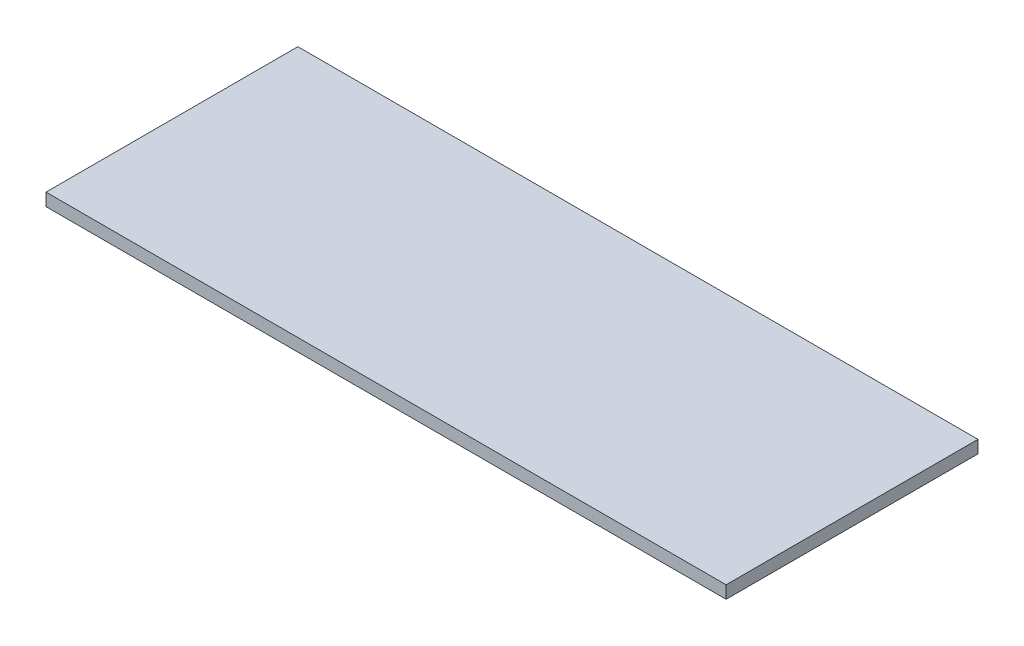
ISO-10303-21;
HEADER;
FILE_DESCRIPTION(('STEP AP214'),'2;1');
FILE_NAME('part.step','',(''),(''),'','','');
FILE_SCHEMA(('AUTOMOTIVE_DESIGN { 1 0 10303 214 1 1 1 1 }'));
ENDSEC;
DATA;
#1=APPLICATION_CONTEXT('core data for automotive mechanical design processes');
#2=APPLICATION_PROTOCOL_DEFINITION('international standard','automotive_design',2000,#1);
#3=PRODUCT_CONTEXT('',#1,'mechanical');
#4=PRODUCT('Part','Part','',(#3));
#5=PRODUCT_RELATED_PRODUCT_CATEGORY('part','',(#4));
#6=PRODUCT_DEFINITION_FORMATION('','',#4);
#7=PRODUCT_DEFINITION_CONTEXT('part definition',#1,'design');
#8=PRODUCT_DEFINITION('design','',#6,#7);
#9=PRODUCT_DEFINITION_SHAPE('','',#8);
#10=(LENGTH_UNIT() NAMED_UNIT(*) SI_UNIT(.MILLI.,.METRE.));
#11=(NAMED_UNIT(*) PLANE_ANGLE_UNIT() SI_UNIT($,.RADIAN.));
#12=(NAMED_UNIT(*) SI_UNIT($,.STERADIAN.) SOLID_ANGLE_UNIT());
#13=UNCERTAINTY_MEASURE_WITH_UNIT(LENGTH_MEASURE(1.E-05),#10,'distance_accuracy_value','');
#14=(GEOMETRIC_REPRESENTATION_CONTEXT(3) GLOBAL_UNCERTAINTY_ASSIGNED_CONTEXT((#13)) GLOBAL_UNIT_ASSIGNED_CONTEXT((#10,
#11,#12)) REPRESENTATION_CONTEXT('',''));
#15=CARTESIAN_POINT('',(0.,0.,0.));
#16=DIRECTION('',(0.,0.,1.));
#17=DIRECTION('',(1.,0.,0.));
#18=AXIS2_PLACEMENT_3D('',#15,#16,#17);
#19=CARTESIAN_POINT('',(81.,3.,-30.));
#20=DIRECTION('',(-1.,0.,0.));
#21=DIRECTION('',(0.,0.,1.));
#22=AXIS2_PLACEMENT_3D('',#19,#20,#21);
#23=PLANE('',#22);
#24=DIRECTION('',(0.,0.,-1.));
#25=VECTOR('',#24,1.);
#26=CARTESIAN_POINT('',(81.,0.,-30.));
#27=LINE('',#26,#25);
#28=CARTESIAN_POINT('',(81.,0.,30.));
#29=VERTEX_POINT('',#28);
#30=CARTESIAN_POINT('',(81.,0.,-30.));
#31=VERTEX_POINT('',#30);
#32=EDGE_CURVE('E107',#29,#31,#27,.T.);
#33=ORIENTED_EDGE('',*,*,#32,.T.);
#34=DIRECTION('',(0.,-1.,0.));
#35=VECTOR('',#34,1.);
#36=CARTESIAN_POINT('',(81.,3.,-30.));
#37=LINE('',#36,#35);
#38=CARTESIAN_POINT('',(81.,3.,-30.));
#39=VERTEX_POINT('',#38);
#40=EDGE_CURVE('E11',#39,#31,#37,.T.);
#41=ORIENTED_EDGE('',*,*,#40,.F.);
#42=DIRECTION('',(0.,0.,-1.));
#43=VECTOR('',#42,1.);
#44=CARTESIAN_POINT('',(81.,3.,-30.));
#45=LINE('',#44,#43);
#46=CARTESIAN_POINT('',(81.,3.,30.));
#47=VERTEX_POINT('',#46);
#48=EDGE_CURVE('E91',#47,#39,#45,.T.);
#49=ORIENTED_EDGE('',*,*,#48,.F.);
#50=DIRECTION('',(0.,-1.,0.));
#51=VECTOR('',#50,1.);
#52=CARTESIAN_POINT('',(81.,3.,30.));
#53=LINE('',#52,#51);
#54=EDGE_CURVE('E103',#47,#29,#53,.T.);
#55=ORIENTED_EDGE('',*,*,#54,.T.);
#56=EDGE_LOOP('',(#33,#41,#49,#55));
#57=FACE_BOUND('',#56,.T.);
#58=ADVANCED_FACE('F39',(#57),#23,.F.);
#59=CARTESIAN_POINT('',(-81.,3.,-30.));
#60=DIRECTION('',(0.,0.,1.));
#61=DIRECTION('',(1.,0.,0.));
#62=AXIS2_PLACEMENT_3D('',#59,#60,#61);
#63=PLANE('',#62);
#64=DIRECTION('',(-1.,0.,0.));
#65=VECTOR('',#64,1.);
#66=CARTESIAN_POINT('',(-81.,0.,-30.));
#67=LINE('',#66,#65);
#68=CARTESIAN_POINT('',(-81.,0.,-30.));
#69=VERTEX_POINT('',#68);
#70=EDGE_CURVE('E96',#31,#69,#67,.T.);
#71=ORIENTED_EDGE('',*,*,#70,.T.);
#72=DIRECTION('',(0.,-1.,0.));
#73=VECTOR('',#72,1.);
#74=CARTESIAN_POINT('',(-81.,3.,-30.));
#75=LINE('',#74,#73);
#76=CARTESIAN_POINT('',(-81.,3.,-30.));
#77=VERTEX_POINT('',#76);
#78=EDGE_CURVE('E48',#77,#69,#75,.T.);
#79=ORIENTED_EDGE('',*,*,#78,.F.);
#80=DIRECTION('',(-1.,0.,0.));
#81=VECTOR('',#80,1.);
#82=CARTESIAN_POINT('',(-81.,3.,-30.));
#83=LINE('',#82,#81);
#84=EDGE_CURVE('E86',#39,#77,#83,.T.);
#85=ORIENTED_EDGE('',*,*,#84,.F.);
#86=ORIENTED_EDGE('',*,*,#40,.T.);
#87=EDGE_LOOP('',(#71,#79,#85,#86));
#88=FACE_BOUND('',#87,.T.);
#89=ADVANCED_FACE('F95',(#88),#63,.F.);
#90=CARTESIAN_POINT('',(-81.,3.,-30.));
#91=DIRECTION('',(1.,0.,0.));
#92=DIRECTION('',(0.,0.,-1.));
#93=AXIS2_PLACEMENT_3D('',#90,#91,#92);
#94=PLANE('',#93);
#95=DIRECTION('',(0.,0.,1.));
#96=VECTOR('',#95,1.);
#97=CARTESIAN_POINT('',(-81.,0.,-30.));
#98=LINE('',#97,#96);
#99=CARTESIAN_POINT('',(-81.,0.,30.));
#100=VERTEX_POINT('',#99);
#101=EDGE_CURVE('E73',#69,#100,#98,.T.);
#102=ORIENTED_EDGE('',*,*,#101,.T.);
#103=DIRECTION('',(0.,-1.,0.));
#104=VECTOR('',#103,1.);
#105=CARTESIAN_POINT('',(-81.,3.,30.));
#106=LINE('',#105,#104);
#107=CARTESIAN_POINT('',(-81.,3.,30.));
#108=VERTEX_POINT('',#107);
#109=EDGE_CURVE('E98',#108,#100,#106,.T.);
#110=ORIENTED_EDGE('',*,*,#109,.F.);
#111=DIRECTION('',(0.,0.,1.));
#112=VECTOR('',#111,1.);
#113=CARTESIAN_POINT('',(-81.,3.,-30.));
#114=LINE('',#113,#112);
#115=EDGE_CURVE('E89',#77,#108,#114,.T.);
#116=ORIENTED_EDGE('',*,*,#115,.F.);
#117=ORIENTED_EDGE('',*,*,#78,.T.);
#118=EDGE_LOOP('',(#102,#110,#116,#117));
#119=FACE_BOUND('',#118,.T.);
#120=ADVANCED_FACE('F99',(#119),#94,.F.);
#121=CARTESIAN_POINT('',(-81.,3.,30.));
#122=DIRECTION('',(0.,0.,-1.));
#123=DIRECTION('',(-1.,0.,0.));
#124=AXIS2_PLACEMENT_3D('',#121,#122,#123);
#125=PLANE('',#124);
#126=DIRECTION('',(1.,0.,0.));
#127=VECTOR('',#126,1.);
#128=CARTESIAN_POINT('',(-81.,0.,30.));
#129=LINE('',#128,#127);
#130=EDGE_CURVE('E79',#100,#29,#129,.T.);
#131=ORIENTED_EDGE('',*,*,#130,.T.);
#132=ORIENTED_EDGE('',*,*,#54,.F.);
#133=DIRECTION('',(1.,0.,0.));
#134=VECTOR('',#133,1.);
#135=CARTESIAN_POINT('',(-81.,3.,30.));
#136=LINE('',#135,#134);
#137=EDGE_CURVE('E56',#108,#47,#136,.T.);
#138=ORIENTED_EDGE('',*,*,#137,.F.);
#139=ORIENTED_EDGE('',*,*,#109,.T.);
#140=EDGE_LOOP('',(#131,#132,#138,#139));
#141=FACE_BOUND('',#140,.T.);
#142=ADVANCED_FACE('F120',(#141),#125,.F.);
#143=CARTESIAN_POINT('',(0.,3.,0.));
#144=DIRECTION('',(0.,1.,0.));
#145=DIRECTION('',(0.,0.,1.));
#146=AXIS2_PLACEMENT_3D('',#143,#144,#145);
#147=PLANE('',#146);
#148=ORIENTED_EDGE('',*,*,#48,.T.);
#149=ORIENTED_EDGE('',*,*,#84,.T.);
#150=ORIENTED_EDGE('',*,*,#115,.T.);
#151=ORIENTED_EDGE('',*,*,#137,.T.);
#152=EDGE_LOOP('',(#148,#149,#150,#151));
#153=FACE_BOUND('',#152,.T.);
#154=ADVANCED_FACE('F87',(#153),#147,.T.);
#155=CARTESIAN_POINT('',(0.,0.,0.));
#156=DIRECTION('',(0.,1.,0.));
#157=DIRECTION('',(0.,0.,1.));
#158=AXIS2_PLACEMENT_3D('',#155,#156,#157);
#159=PLANE('',#158);
#160=ORIENTED_EDGE('',*,*,#32,.F.);
#161=ORIENTED_EDGE('',*,*,#130,.F.);
#162=ORIENTED_EDGE('',*,*,#101,.F.);
#163=ORIENTED_EDGE('',*,*,#70,.F.);
#164=EDGE_LOOP('',(#160,#161,#162,#163));
#165=FACE_BOUND('',#164,.T.);
#166=ADVANCED_FACE('F123',(#165),#159,.F.);
#167=CLOSED_SHELL('',(#58,#89,#120,#142,#154,#166));
#168=MANIFOLD_SOLID_BREP('B2',#167);
#169=ADVANCED_BREP_SHAPE_REPRESENTATION('',(#18,#168),#14);
#170=SHAPE_DEFINITION_REPRESENTATION(#9,#169);
ENDSEC;
END-ISO-10303-21;
